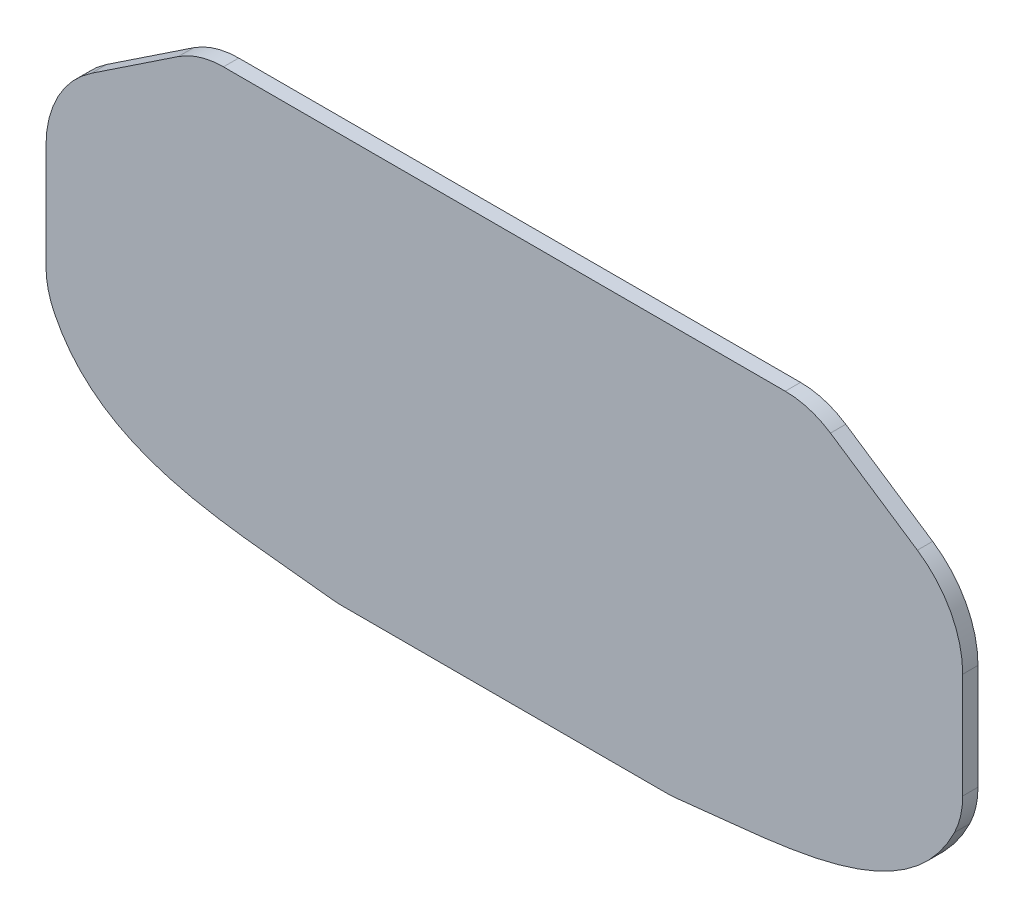
ISO-10303-21;
HEADER;
FILE_DESCRIPTION(('STEP AP214'),'2;1');
FILE_NAME('part.step','',(''),(''),'','','');
FILE_SCHEMA(('AUTOMOTIVE_DESIGN { 1 0 10303 214 1 1 1 1 }'));
ENDSEC;
DATA;
#1=APPLICATION_CONTEXT('core data for automotive mechanical design processes');
#2=APPLICATION_PROTOCOL_DEFINITION('international standard','automotive_design',2000,#1);
#3=PRODUCT_CONTEXT('',#1,'mechanical');
#4=PRODUCT('Part','Part','',(#3));
#5=PRODUCT_RELATED_PRODUCT_CATEGORY('part','',(#4));
#6=PRODUCT_DEFINITION_FORMATION('','',#4);
#7=PRODUCT_DEFINITION_CONTEXT('part definition',#1,'design');
#8=PRODUCT_DEFINITION('design','',#6,#7);
#9=PRODUCT_DEFINITION_SHAPE('','',#8);
#10=(LENGTH_UNIT() NAMED_UNIT(*) SI_UNIT(.MILLI.,.METRE.));
#11=(NAMED_UNIT(*) PLANE_ANGLE_UNIT() SI_UNIT($,.RADIAN.));
#12=(NAMED_UNIT(*) SI_UNIT($,.STERADIAN.) SOLID_ANGLE_UNIT());
#13=UNCERTAINTY_MEASURE_WITH_UNIT(LENGTH_MEASURE(1.E-05),#10,'distance_accuracy_value','');
#14=(GEOMETRIC_REPRESENTATION_CONTEXT(3) GLOBAL_UNCERTAINTY_ASSIGNED_CONTEXT((#13)) GLOBAL_UNIT_ASSIGNED_CONTEXT((#10,
#11,#12)) REPRESENTATION_CONTEXT('',''));
#15=CARTESIAN_POINT('',(0.,0.,0.));
#16=DIRECTION('',(0.,0.,1.));
#17=DIRECTION('',(1.,0.,0.));
#18=AXIS2_PLACEMENT_3D('',#15,#16,#17);
#19=CARTESIAN_POINT('',(0.,0.,3.81));
#20=DIRECTION('',(-1.,0.,0.));
#21=DIRECTION('',(0.,0.,1.));
#22=AXIS2_PLACEMENT_3D('',#19,#20,#21);
#23=PLANE('',#22);
#24=DIRECTION('',(0.,1.,0.));
#25=VECTOR('',#24,1.);
#26=CARTESIAN_POINT('',(0.,0.,0.));
#27=LINE('',#26,#25);
#28=CARTESIAN_POINT('',(0.,36.3067173885473,0.));
#29=VERTEX_POINT('',#28);
#30=CARTESIAN_POINT('',(0.,62.6063325344048,0.));
#31=VERTEX_POINT('',#30);
#32=EDGE_CURVE('E192',#29,#31,#27,.T.);
#33=ORIENTED_EDGE('',*,*,#32,.F.);
#34=DIRECTION('',(0.,0.,1.));
#35=VECTOR('',#34,1.);
#36=CARTESIAN_POINT('',(0.,36.3067173885473,3.81));
#37=LINE('',#36,#35);
#38=CARTESIAN_POINT('',(0.,36.3067173885473,3.81));
#39=VERTEX_POINT('',#38);
#40=EDGE_CURVE('E235',#29,#39,#37,.T.);
#41=ORIENTED_EDGE('',*,*,#40,.T.);
#42=DIRECTION('',(0.,1.,0.));
#43=VECTOR('',#42,1.);
#44=CARTESIAN_POINT('',(0.,0.,3.81));
#45=LINE('',#44,#43);
#46=CARTESIAN_POINT('',(0.,62.6063325344048,3.81));
#47=VERTEX_POINT('',#46);
#48=EDGE_CURVE('E186',#39,#47,#45,.T.);
#49=ORIENTED_EDGE('',*,*,#48,.T.);
#50=DIRECTION('',(0.,0.,-1.));
#51=VECTOR('',#50,1.);
#52=CARTESIAN_POINT('',(0.,62.6063325344048,3.81));
#53=LINE('',#52,#51);
#54=EDGE_CURVE('E217',#47,#31,#53,.T.);
#55=ORIENTED_EDGE('',*,*,#54,.T.);
#56=EDGE_LOOP('',(#33,#41,#49,#55));
#57=FACE_BOUND('',#56,.T.);
#58=ADVANCED_FACE('F43',(#57),#23,.T.);
#59=CARTESIAN_POINT('',(228.6,0.,3.81));
#60=DIRECTION('',(0.,-1.,0.));
#61=DIRECTION('',(0.,0.,-1.));
#62=AXIS2_PLACEMENT_3D('',#59,#60,#61);
#63=PLANE('',#62);
#64=DIRECTION('',(-1.,0.,0.));
#65=VECTOR('',#64,1.);
#66=CARTESIAN_POINT('',(228.6,0.,0.));
#67=LINE('',#66,#65);
#68=CARTESIAN_POINT('',(154.911551716951,0.,0.));
#69=VERTEX_POINT('',#68);
#70=CARTESIAN_POINT('',(73.6884482830485,0.,0.));
#71=VERTEX_POINT('',#70);
#72=EDGE_CURVE('E252',#69,#71,#67,.T.);
#73=ORIENTED_EDGE('',*,*,#72,.F.);
#74=DIRECTION('',(0.,0.,-1.));
#75=VECTOR('',#74,1.);
#76=CARTESIAN_POINT('',(154.911551716951,0.,3.81));
#77=LINE('',#76,#75);
#78=CARTESIAN_POINT('',(154.911551716951,0.,3.81));
#79=VERTEX_POINT('',#78);
#80=EDGE_CURVE('E242',#69,#79,#77,.F.);
#81=ORIENTED_EDGE('',*,*,#80,.T.);
#82=DIRECTION('',(-1.,0.,0.));
#83=VECTOR('',#82,1.);
#84=CARTESIAN_POINT('',(228.6,0.,3.81));
#85=LINE('',#84,#83);
#86=CARTESIAN_POINT('',(73.6884482830485,0.,3.81));
#87=VERTEX_POINT('',#86);
#88=EDGE_CURVE('E189',#79,#87,#85,.T.);
#89=ORIENTED_EDGE('',*,*,#88,.T.);
#90=DIRECTION('',(0.,0.,1.));
#91=VECTOR('',#90,1.);
#92=CARTESIAN_POINT('',(73.6884482830485,0.,3.81));
#93=LINE('',#92,#91);
#94=EDGE_CURVE('E240',#87,#71,#93,.F.);
#95=ORIENTED_EDGE('',*,*,#94,.T.);
#96=EDGE_LOOP('',(#73,#81,#89,#95));
#97=FACE_BOUND('',#96,.T.);
#98=ADVANCED_FACE('F257',(#97),#63,.T.);
#99=CARTESIAN_POINT('',(0.,0.,3.81));
#100=DIRECTION('',(0.,0.,-1.));
#101=DIRECTION('',(-1.,0.,0.));
#102=AXIS2_PLACEMENT_3D('',#99,#100,#101);
#103=PLANE('',#102);
#104=ORIENTED_EDGE('',*,*,#88,.F.);
#105=CARTESIAN_POINT('',(154.911551716951,20.32,3.81));
#106=DIRECTION('',(0.,0.,-1.));
#107=DIRECTION('',(-1.,0.,0.));
#108=AXIS2_PLACEMENT_3D('',#105,#106,#107);
#109=CIRCLE('',#108,20.32);
#110=CARTESIAN_POINT('',(157.543784974881,0.171209761480727,3.81));
#111=VERTEX_POINT('',#110);
#112=EDGE_CURVE('E247',#79,#111,#109,.F.);
#113=ORIENTED_EDGE('',*,*,#112,.T.);
#114=CARTESIAN_POINT('',(228.6,32.4836909668739,3.81));
#115=CARTESIAN_POINT('',(218.54052151117,1.8403987620338,3.81));
#116=CARTESIAN_POINT('',(180.763909957035,3.41703679861688,3.81));
#117=CARTESIAN_POINT('',(156.27521933411,0.,3.81));
#118=B_SPLINE_CURVE_WITH_KNOTS('',3,(#114,#115,#116,#117),.UNSPECIFIED.,.F.,.F.,(4,4),(0.,1.),.UNSPECIFIED.);
#119=CARTESIAN_POINT('',(226.530401820969,27.3722205715367,3.81));
#120=VERTEX_POINT('',#119);
#121=EDGE_CURVE('E266',#120,#111,#118,.T.);
#122=ORIENTED_EDGE('',*,*,#121,.F.);
#123=CARTESIAN_POINT('',(208.28,36.3067173885474,3.81));
#124=DIRECTION('',(0.,0.,-1.));
#125=DIRECTION('',(-1.,0.,0.));
#126=AXIS2_PLACEMENT_3D('',#123,#124,#125);
#127=CIRCLE('',#126,20.32);
#128=CARTESIAN_POINT('',(228.6,36.3067173885474,3.81));
#129=VERTEX_POINT('',#128);
#130=EDGE_CURVE('E227',#120,#129,#127,.F.);
#131=ORIENTED_EDGE('',*,*,#130,.T.);
#132=DIRECTION('',(0.,-1.,0.));
#133=VECTOR('',#132,1.);
#134=CARTESIAN_POINT('',(228.6,76.2,3.81));
#135=LINE('',#134,#133);
#136=CARTESIAN_POINT('',(228.6,62.6063325344049,3.81));
#137=VERTEX_POINT('',#136);
#138=EDGE_CURVE('E362',#137,#129,#135,.T.);
#139=ORIENTED_EDGE('',*,*,#138,.F.);
#140=CARTESIAN_POINT('',(203.2,62.6063325344049,3.81));
#141=DIRECTION('',(0.,0.,-1.));
#142=DIRECTION('',(-1.,0.,0.));
#143=AXIS2_PLACEMENT_3D('',#140,#141,#142);
#144=CIRCLE('',#143,25.4);
#145=CARTESIAN_POINT('',(217.289384984121,83.7404100105861,3.81));
#146=VERTEX_POINT('',#145);
#147=EDGE_CURVE('E215',#137,#146,#144,.F.);
#148=ORIENTED_EDGE('',*,*,#147,.T.);
#149=DIRECTION('',(0.832050294337844,-0.554700196225229,0.));
#150=VECTOR('',#149,1.);
#151=CARTESIAN_POINT('',(190.5,101.6,3.81));
#152=LINE('',#151,#150);
#153=CARTESIAN_POINT('',(195.619107028583,98.1872619809449,3.81));
#154=VERTEX_POINT('',#153);
#155=EDGE_CURVE('E358',#154,#146,#152,.T.);
#156=ORIENTED_EDGE('',*,*,#155,.F.);
#157=CARTESIAN_POINT('',(184.347599041286,81.28,3.81));
#158=DIRECTION('',(0.,0.,-1.));
#159=DIRECTION('',(-1.,0.,0.));
#160=AXIS2_PLACEMENT_3D('',#157,#158,#159);
#161=CIRCLE('',#160,20.32);
#162=CARTESIAN_POINT('',(184.347599041286,101.6,3.81));
#163=VERTEX_POINT('',#162);
#164=EDGE_CURVE('E198',#154,#163,#161,.F.);
#165=ORIENTED_EDGE('',*,*,#164,.T.);
#166=DIRECTION('',(1.,0.,0.));
#167=VECTOR('',#166,1.);
#168=CARTESIAN_POINT('',(38.1,101.6,3.81));
#169=LINE('',#168,#167);
#170=CARTESIAN_POINT('',(44.2524009587141,101.6,3.81));
#171=VERTEX_POINT('',#170);
#172=EDGE_CURVE('E356',#171,#163,#169,.T.);
#173=ORIENTED_EDGE('',*,*,#172,.F.);
#174=CARTESIAN_POINT('',(44.2524009587141,81.28,3.81));
#175=DIRECTION('',(0.,0.,-1.));
#176=DIRECTION('',(-1.,0.,0.));
#177=AXIS2_PLACEMENT_3D('',#174,#175,#176);
#178=CIRCLE('',#177,20.32);
#179=CARTESIAN_POINT('',(32.9808929714175,98.187261980945,3.81));
#180=VERTEX_POINT('',#179);
#181=EDGE_CURVE('E200',#171,#180,#178,.F.);
#182=ORIENTED_EDGE('',*,*,#181,.T.);
#183=DIRECTION('',(0.832050294337843,0.554700196225229,0.));
#184=VECTOR('',#183,1.);
#185=CARTESIAN_POINT('',(0.,76.2,3.81));
#186=LINE('',#185,#184);
#187=CARTESIAN_POINT('',(11.3106150158792,83.7404100105861,3.81));
#188=VERTEX_POINT('',#187);
#189=EDGE_CURVE('E184',#188,#180,#186,.T.);
#190=ORIENTED_EDGE('',*,*,#189,.F.);
#191=CARTESIAN_POINT('',(25.4,62.6063325344048,3.81));
#192=DIRECTION('',(0.,0.,-1.));
#193=DIRECTION('',(-1.,0.,0.));
#194=AXIS2_PLACEMENT_3D('',#191,#192,#193);
#195=CIRCLE('',#194,25.4);
#196=EDGE_CURVE('E212',#188,#47,#195,.F.);
#197=ORIENTED_EDGE('',*,*,#196,.T.);
#198=ORIENTED_EDGE('',*,*,#48,.F.);
#199=CARTESIAN_POINT('',(20.32,36.3067173885473,3.81));
#200=DIRECTION('',(0.,0.,-1.));
#201=DIRECTION('',(-1.,0.,0.));
#202=AXIS2_PLACEMENT_3D('',#199,#200,#201);
#203=CIRCLE('',#202,20.32);
#204=CARTESIAN_POINT('',(2.06959817903115,27.3722205715365,3.81));
#205=VERTEX_POINT('',#204);
#206=EDGE_CURVE('E225',#39,#205,#203,.F.);
#207=ORIENTED_EDGE('',*,*,#206,.T.);
#208=CARTESIAN_POINT('',(0.,32.4836909668739,3.81));
#209=CARTESIAN_POINT('',(10.0594784888304,1.84039876203379,3.81));
#210=CARTESIAN_POINT('',(47.8360900429649,3.41703679861685,3.81));
#211=CARTESIAN_POINT('',(72.3247806658904,0.,3.81));
#212=B_SPLINE_CURVE_WITH_KNOTS('',3,(#208,#209,#210,#211),.UNSPECIFIED.,.F.,.F.,(4,4),(0.,1.),.UNSPECIFIED.);
#213=CARTESIAN_POINT('',(71.0562150251189,0.171209761480717,3.81));
#214=VERTEX_POINT('',#213);
#215=EDGE_CURVE('E269',#205,#214,#212,.T.);
#216=ORIENTED_EDGE('',*,*,#215,.T.);
#217=CARTESIAN_POINT('',(73.6884482830485,20.32,3.81));
#218=DIRECTION('',(0.,0.,-1.));
#219=DIRECTION('',(-1.,0.,0.));
#220=AXIS2_PLACEMENT_3D('',#217,#218,#219);
#221=CIRCLE('',#220,20.32);
#222=EDGE_CURVE('E245',#214,#87,#221,.F.);
#223=ORIENTED_EDGE('',*,*,#222,.T.);
#224=EDGE_LOOP('',(#104,#113,#122,#131,#139,#148,#156,#165,#173,#182,#190,#197,#198,#207,#216,#223));
#225=FACE_BOUND('',#224,.T.);
#226=ADVANCED_FACE('F265',(#225),#103,.F.);
#227=CARTESIAN_POINT('',(0.,0.,0.));
#228=DIRECTION('',(0.,0.,-1.));
#229=DIRECTION('',(-1.,0.,0.));
#230=AXIS2_PLACEMENT_3D('',#227,#228,#229);
#231=PLANE('',#230);
#232=CARTESIAN_POINT('',(228.6,32.4836909668739,0.));
#233=CARTESIAN_POINT('',(218.54052151117,1.8403987620338,0.));
#234=CARTESIAN_POINT('',(180.763909957035,3.41703679861688,0.));
#235=CARTESIAN_POINT('',(156.27521933411,0.,0.));
#236=B_SPLINE_CURVE_WITH_KNOTS('',3,(#232,#233,#234,#235),.UNSPECIFIED.,.F.,.F.,(4,4),(0.,1.),.UNSPECIFIED.);
#237=CARTESIAN_POINT('',(226.530401820969,27.3722205715367,0.));
#238=VERTEX_POINT('',#237);
#239=CARTESIAN_POINT('',(157.543784974881,0.171209761480727,0.));
#240=VERTEX_POINT('',#239);
#241=EDGE_CURVE('E253',#238,#240,#236,.T.);
#242=ORIENTED_EDGE('',*,*,#241,.T.);
#243=CARTESIAN_POINT('',(154.911551716951,20.32,0.));
#244=DIRECTION('',(0.,0.,-1.));
#245=DIRECTION('',(-1.,0.,0.));
#246=AXIS2_PLACEMENT_3D('',#243,#244,#245);
#247=CIRCLE('',#246,20.32);
#248=EDGE_CURVE('E51',#240,#69,#247,.T.);
#249=ORIENTED_EDGE('',*,*,#248,.T.);
#250=ORIENTED_EDGE('',*,*,#72,.T.);
#251=CARTESIAN_POINT('',(73.6884482830485,20.32,0.));
#252=DIRECTION('',(0.,0.,-1.));
#253=DIRECTION('',(-1.,0.,0.));
#254=AXIS2_PLACEMENT_3D('',#251,#252,#253);
#255=CIRCLE('',#254,20.32);
#256=CARTESIAN_POINT('',(71.0562150251189,0.171209761480717,0.));
#257=VERTEX_POINT('',#256);
#258=EDGE_CURVE('E58',#71,#257,#255,.T.);
#259=ORIENTED_EDGE('',*,*,#258,.T.);
#260=CARTESIAN_POINT('',(0.,32.4836909668739,0.));
#261=CARTESIAN_POINT('',(10.0594784888304,1.84039876203379,0.));
#262=CARTESIAN_POINT('',(47.8360900429649,3.41703679861685,0.));
#263=CARTESIAN_POINT('',(72.3247806658904,0.,0.));
#264=B_SPLINE_CURVE_WITH_KNOTS('',3,(#260,#261,#262,#263),.UNSPECIFIED.,.F.,.F.,(4,4),(0.,1.),.UNSPECIFIED.);
#265=CARTESIAN_POINT('',(2.06959817903116,27.3722205715364,0.));
#266=VERTEX_POINT('',#265);
#267=EDGE_CURVE('E170',#266,#257,#264,.T.);
#268=ORIENTED_EDGE('',*,*,#267,.F.);
#269=CARTESIAN_POINT('',(20.32,36.3067173885473,0.));
#270=DIRECTION('',(0.,0.,-1.));
#271=DIRECTION('',(-1.,0.,0.));
#272=AXIS2_PLACEMENT_3D('',#269,#270,#271);
#273=CIRCLE('',#272,20.32);
#274=EDGE_CURVE('E231',#266,#29,#273,.T.);
#275=ORIENTED_EDGE('',*,*,#274,.T.);
#276=ORIENTED_EDGE('',*,*,#32,.T.);
#277=CARTESIAN_POINT('',(25.4,62.6063325344048,0.));
#278=DIRECTION('',(0.,0.,-1.));
#279=DIRECTION('',(-1.,0.,0.));
#280=AXIS2_PLACEMENT_3D('',#277,#278,#279);
#281=CIRCLE('',#280,25.4);
#282=CARTESIAN_POINT('',(11.3106150158792,83.7404100105861,0.));
#283=VERTEX_POINT('',#282);
#284=EDGE_CURVE('E165',#31,#283,#281,.T.);
#285=ORIENTED_EDGE('',*,*,#284,.T.);
#286=DIRECTION('',(0.832050294337843,0.554700196225229,0.));
#287=VECTOR('',#286,1.);
#288=CARTESIAN_POINT('',(0.,76.2,0.));
#289=LINE('',#288,#287);
#290=CARTESIAN_POINT('',(32.9808929714175,98.187261980945,0.));
#291=VERTEX_POINT('',#290);
#292=EDGE_CURVE('E158',#283,#291,#289,.T.);
#293=ORIENTED_EDGE('',*,*,#292,.T.);
#294=CARTESIAN_POINT('',(44.2524009587141,81.28,0.));
#295=DIRECTION('',(0.,0.,-1.));
#296=DIRECTION('',(-1.,0.,0.));
#297=AXIS2_PLACEMENT_3D('',#294,#295,#296);
#298=CIRCLE('',#297,20.32);
#299=CARTESIAN_POINT('',(44.2524009587141,101.6,0.));
#300=VERTEX_POINT('',#299);
#301=EDGE_CURVE('E162',#291,#300,#298,.T.);
#302=ORIENTED_EDGE('',*,*,#301,.T.);
#303=DIRECTION('',(1.,0.,0.));
#304=VECTOR('',#303,1.);
#305=CARTESIAN_POINT('',(38.1,101.6,0.));
#306=LINE('',#305,#304);
#307=CARTESIAN_POINT('',(184.347599041286,101.6,0.));
#308=VERTEX_POINT('',#307);
#309=EDGE_CURVE('E169',#300,#308,#306,.T.);
#310=ORIENTED_EDGE('',*,*,#309,.T.);
#311=CARTESIAN_POINT('',(184.347599041286,81.28,0.));
#312=DIRECTION('',(0.,0.,-1.));
#313=DIRECTION('',(-1.,0.,0.));
#314=AXIS2_PLACEMENT_3D('',#311,#312,#313);
#315=CIRCLE('',#314,20.32);
#316=CARTESIAN_POINT('',(195.619107028583,98.1872619809449,0.));
#317=VERTEX_POINT('',#316);
#318=EDGE_CURVE('E180',#308,#317,#315,.T.);
#319=ORIENTED_EDGE('',*,*,#318,.T.);
#320=DIRECTION('',(0.832050294337844,-0.554700196225229,0.));
#321=VECTOR('',#320,1.);
#322=CARTESIAN_POINT('',(190.5,101.6,0.));
#323=LINE('',#322,#321);
#324=CARTESIAN_POINT('',(217.289384984121,83.7404100105861,0.));
#325=VERTEX_POINT('',#324);
#326=EDGE_CURVE('E369',#317,#325,#323,.T.);
#327=ORIENTED_EDGE('',*,*,#326,.T.);
#328=CARTESIAN_POINT('',(203.2,62.6063325344049,0.));
#329=DIRECTION('',(0.,0.,-1.));
#330=DIRECTION('',(-1.,0.,0.));
#331=AXIS2_PLACEMENT_3D('',#328,#329,#330);
#332=CIRCLE('',#331,25.4);
#333=CARTESIAN_POINT('',(228.6,62.6063325344049,0.));
#334=VERTEX_POINT('',#333);
#335=EDGE_CURVE('E208',#325,#334,#332,.T.);
#336=ORIENTED_EDGE('',*,*,#335,.T.);
#337=DIRECTION('',(0.,-1.,0.));
#338=VECTOR('',#337,1.);
#339=CARTESIAN_POINT('',(228.6,76.2,0.));
#340=LINE('',#339,#338);
#341=CARTESIAN_POINT('',(228.6,36.3067173885474,0.));
#342=VERTEX_POINT('',#341);
#343=EDGE_CURVE('E261',#334,#342,#340,.T.);
#344=ORIENTED_EDGE('',*,*,#343,.T.);
#345=CARTESIAN_POINT('',(208.28,36.3067173885474,0.));
#346=DIRECTION('',(0.,0.,-1.));
#347=DIRECTION('',(-1.,0.,0.));
#348=AXIS2_PLACEMENT_3D('',#345,#346,#347);
#349=CIRCLE('',#348,20.32);
#350=EDGE_CURVE('E233',#342,#238,#349,.T.);
#351=ORIENTED_EDGE('',*,*,#350,.T.);
#352=EDGE_LOOP('',(#242,#249,#250,#259,#268,#275,#276,#285,#293,#302,#310,#319,#327,#336,#344,#351));
#353=FACE_BOUND('',#352,.T.);
#354=ADVANCED_FACE('F160',(#353),#231,.T.);
#355=CARTESIAN_POINT('',(0.,76.2,3.81));
#356=DIRECTION('',(-0.554700196225229,0.832050294337844,0.));
#357=DIRECTION('',(-0.832050294337844,-0.554700196225229,0.));
#358=AXIS2_PLACEMENT_3D('',#355,#356,#357);
#359=PLANE('',#358);
#360=ORIENTED_EDGE('',*,*,#292,.F.);
#361=DIRECTION('',(0.,0.,-1.));
#362=VECTOR('',#361,1.);
#363=CARTESIAN_POINT('',(11.3106150158792,83.7404100105861,3.81));
#364=LINE('',#363,#362);
#365=EDGE_CURVE('E220',#283,#188,#364,.F.);
#366=ORIENTED_EDGE('',*,*,#365,.T.);
#367=ORIENTED_EDGE('',*,*,#189,.T.);
#368=DIRECTION('',(0.,0.,-1.));
#369=VECTOR('',#368,1.);
#370=CARTESIAN_POINT('',(32.9808929714175,98.187261980945,3.81));
#371=LINE('',#370,#369);
#372=EDGE_CURVE('E177',#180,#291,#371,.T.);
#373=ORIENTED_EDGE('',*,*,#372,.T.);
#374=EDGE_LOOP('',(#360,#366,#367,#373));
#375=FACE_BOUND('',#374,.T.);
#376=ADVANCED_FACE('F182',(#375),#359,.T.);
#377=CARTESIAN_POINT('',(228.6,76.2,3.81));
#378=DIRECTION('',(1.,0.,0.));
#379=DIRECTION('',(0.,0.,-1.));
#380=AXIS2_PLACEMENT_3D('',#377,#378,#379);
#381=PLANE('',#380);
#382=ORIENTED_EDGE('',*,*,#138,.T.);
#383=DIRECTION('',(0.,0.,-1.));
#384=VECTOR('',#383,1.);
#385=CARTESIAN_POINT('',(228.6,36.3067173885474,0.));
#386=LINE('',#385,#384);
#387=EDGE_CURVE('E229',#129,#342,#386,.T.);
#388=ORIENTED_EDGE('',*,*,#387,.T.);
#389=ORIENTED_EDGE('',*,*,#343,.F.);
#390=DIRECTION('',(0.,0.,-1.));
#391=VECTOR('',#390,1.);
#392=CARTESIAN_POINT('',(228.6,62.6063325344049,3.81));
#393=LINE('',#392,#391);
#394=EDGE_CURVE('E210',#334,#137,#393,.F.);
#395=ORIENTED_EDGE('',*,*,#394,.T.);
#396=EDGE_LOOP('',(#382,#388,#389,#395));
#397=FACE_BOUND('',#396,.T.);
#398=ADVANCED_FACE('F305',(#397),#381,.T.);
#399=CARTESIAN_POINT('',(190.5,101.6,3.81));
#400=DIRECTION('',(0.554700196225229,0.832050294337843,0.));
#401=DIRECTION('',(-0.832050294337844,0.554700196225229,0.));
#402=AXIS2_PLACEMENT_3D('',#399,#400,#401);
#403=PLANE('',#402);
#404=ORIENTED_EDGE('',*,*,#155,.T.);
#405=DIRECTION('',(0.,0.,-1.));
#406=VECTOR('',#405,1.);
#407=CARTESIAN_POINT('',(217.289384984121,83.7404100105861,3.81));
#408=LINE('',#407,#406);
#409=EDGE_CURVE('E204',#146,#325,#408,.T.);
#410=ORIENTED_EDGE('',*,*,#409,.T.);
#411=ORIENTED_EDGE('',*,*,#326,.F.);
#412=DIRECTION('',(0.,0.,-1.));
#413=VECTOR('',#412,1.);
#414=CARTESIAN_POINT('',(195.619107028583,98.1872619809449,3.81));
#415=LINE('',#414,#413);
#416=EDGE_CURVE('E202',#317,#154,#415,.F.);
#417=ORIENTED_EDGE('',*,*,#416,.T.);
#418=EDGE_LOOP('',(#404,#410,#411,#417));
#419=FACE_BOUND('',#418,.T.);
#420=ADVANCED_FACE('F308',(#419),#403,.T.);
#421=CARTESIAN_POINT('',(38.1,101.6,3.81));
#422=DIRECTION('',(0.,1.,0.));
#423=DIRECTION('',(0.,0.,1.));
#424=AXIS2_PLACEMENT_3D('',#421,#422,#423);
#425=PLANE('',#424);
#426=ORIENTED_EDGE('',*,*,#309,.F.);
#427=DIRECTION('',(0.,0.,-1.));
#428=VECTOR('',#427,1.);
#429=CARTESIAN_POINT('',(44.2524009587141,101.6,3.81));
#430=LINE('',#429,#428);
#431=EDGE_CURVE('E178',#300,#171,#430,.F.);
#432=ORIENTED_EDGE('',*,*,#431,.T.);
#433=ORIENTED_EDGE('',*,*,#172,.T.);
#434=DIRECTION('',(0.,0.,-1.));
#435=VECTOR('',#434,1.);
#436=CARTESIAN_POINT('',(184.347599041286,101.6,3.81));
#437=LINE('',#436,#435);
#438=EDGE_CURVE('E179',#163,#308,#437,.T.);
#439=ORIENTED_EDGE('',*,*,#438,.T.);
#440=EDGE_LOOP('',(#426,#432,#433,#439));
#441=FACE_BOUND('',#440,.T.);
#442=ADVANCED_FACE('F312',(#441),#425,.T.);
#443=CARTESIAN_POINT('',(44.2524009587141,81.28,3.81));
#444=DIRECTION('',(0.,0.,-1.));
#445=DIRECTION('',(-1.,0.,0.));
#446=AXIS2_PLACEMENT_3D('',#443,#444,#445);
#447=CYLINDRICAL_SURFACE('',#446,20.32);
#448=ORIENTED_EDGE('',*,*,#181,.F.);
#449=ORIENTED_EDGE('',*,*,#431,.F.);
#450=ORIENTED_EDGE('',*,*,#301,.F.);
#451=ORIENTED_EDGE('',*,*,#372,.F.);
#452=EDGE_LOOP('',(#448,#449,#450,#451));
#453=FACE_BOUND('',#452,.T.);
#454=ADVANCED_FACE('F176',(#453),#447,.T.);
#455=CARTESIAN_POINT('',(184.347599041286,81.28,3.81));
#456=DIRECTION('',(0.,0.,-1.));
#457=DIRECTION('',(-1.,0.,0.));
#458=AXIS2_PLACEMENT_3D('',#455,#456,#457);
#459=CYLINDRICAL_SURFACE('',#458,20.32);
#460=ORIENTED_EDGE('',*,*,#164,.F.);
#461=ORIENTED_EDGE('',*,*,#416,.F.);
#462=ORIENTED_EDGE('',*,*,#318,.F.);
#463=ORIENTED_EDGE('',*,*,#438,.F.);
#464=EDGE_LOOP('',(#460,#461,#462,#463));
#465=FACE_BOUND('',#464,.T.);
#466=ADVANCED_FACE('F321',(#465),#459,.T.);
#467=CARTESIAN_POINT('',(203.2,62.6063325344049,3.81));
#468=DIRECTION('',(0.,0.,-1.));
#469=DIRECTION('',(-1.,0.,0.));
#470=AXIS2_PLACEMENT_3D('',#467,#468,#469);
#471=CYLINDRICAL_SURFACE('',#470,25.4);
#472=ORIENTED_EDGE('',*,*,#147,.F.);
#473=ORIENTED_EDGE('',*,*,#394,.F.);
#474=ORIENTED_EDGE('',*,*,#335,.F.);
#475=ORIENTED_EDGE('',*,*,#409,.F.);
#476=EDGE_LOOP('',(#472,#473,#474,#475));
#477=FACE_BOUND('',#476,.T.);
#478=ADVANCED_FACE('F324',(#477),#471,.T.);
#479=CARTESIAN_POINT('',(25.4,62.6063325344048,3.81));
#480=DIRECTION('',(0.,0.,-1.));
#481=DIRECTION('',(-1.,0.,0.));
#482=AXIS2_PLACEMENT_3D('',#479,#480,#481);
#483=CYLINDRICAL_SURFACE('',#482,25.4);
#484=ORIENTED_EDGE('',*,*,#196,.F.);
#485=ORIENTED_EDGE('',*,*,#365,.F.);
#486=ORIENTED_EDGE('',*,*,#284,.F.);
#487=ORIENTED_EDGE('',*,*,#54,.F.);
#488=EDGE_LOOP('',(#484,#485,#486,#487));
#489=FACE_BOUND('',#488,.T.);
#490=ADVANCED_FACE('F295',(#489),#483,.T.);
#491=DIRECTION('',(0.,0.,1.));
#492=VECTOR('',#491,1.);
#493=SURFACE_OF_LINEAR_EXTRUSION('',#236,#492);
#494=ORIENTED_EDGE('',*,*,#121,.T.);
#495=DIRECTION('',(0.,0.,1.));
#496=VECTOR('',#495,1.);
#497=CARTESIAN_POINT('',(157.543784974872,0.171209761479561,3.81));
#498=LINE('',#497,#496);
#499=EDGE_CURVE('E66',#111,#240,#498,.F.);
#500=ORIENTED_EDGE('',*,*,#499,.T.);
#501=ORIENTED_EDGE('',*,*,#241,.F.);
#502=DIRECTION('',(0.,0.,1.));
#503=VECTOR('',#502,1.);
#504=CARTESIAN_POINT('',(226.530401820969,27.3722205715366,0.));
#505=LINE('',#504,#503);
#506=EDGE_CURVE('E222',#238,#120,#505,.T.);
#507=ORIENTED_EDGE('',*,*,#506,.T.);
#508=EDGE_LOOP('',(#494,#500,#501,#507));
#509=FACE_BOUND('',#508,.T.);
#510=ADVANCED_FACE('F267',(#509),#493,.F.);
#511=DIRECTION('',(0.,0.,1.));
#512=VECTOR('',#511,1.);
#513=SURFACE_OF_LINEAR_EXTRUSION('',#264,#512);
#514=ORIENTED_EDGE('',*,*,#267,.T.);
#515=DIRECTION('',(0.,0.,1.));
#516=VECTOR('',#515,1.);
#517=CARTESIAN_POINT('',(71.0562150251279,0.171209761479553,0.));
#518=LINE('',#517,#516);
#519=EDGE_CURVE('E11',#257,#214,#518,.T.);
#520=ORIENTED_EDGE('',*,*,#519,.T.);
#521=ORIENTED_EDGE('',*,*,#215,.F.);
#522=DIRECTION('',(0.,0.,1.));
#523=VECTOR('',#522,1.);
#524=CARTESIAN_POINT('',(2.06959817903116,27.3722205715365,3.81));
#525=LINE('',#524,#523);
#526=EDGE_CURVE('E238',#205,#266,#525,.F.);
#527=ORIENTED_EDGE('',*,*,#526,.T.);
#528=EDGE_LOOP('',(#514,#520,#521,#527));
#529=FACE_BOUND('',#528,.T.);
#530=ADVANCED_FACE('F294',(#529),#513,.T.);
#531=CARTESIAN_POINT('',(208.28,36.3067173885474,1.905));
#532=DIRECTION('',(0.,0.,1.));
#533=DIRECTION('',(1.,0.,0.));
#534=AXIS2_PLACEMENT_3D('',#531,#532,#533);
#535=CYLINDRICAL_SURFACE('',#534,20.32);
#536=ORIENTED_EDGE('',*,*,#350,.F.);
#537=ORIENTED_EDGE('',*,*,#387,.F.);
#538=ORIENTED_EDGE('',*,*,#130,.F.);
#539=ORIENTED_EDGE('',*,*,#506,.F.);
#540=EDGE_LOOP('',(#536,#537,#538,#539));
#541=FACE_BOUND('',#540,.T.);
#542=ADVANCED_FACE('F332',(#541),#535,.T.);
#543=CARTESIAN_POINT('',(20.32,36.3067173885473,1.905));
#544=DIRECTION('',(0.,0.,1.));
#545=DIRECTION('',(1.,0.,0.));
#546=AXIS2_PLACEMENT_3D('',#543,#544,#545);
#547=CYLINDRICAL_SURFACE('',#546,20.32);
#548=ORIENTED_EDGE('',*,*,#274,.F.);
#549=ORIENTED_EDGE('',*,*,#526,.F.);
#550=ORIENTED_EDGE('',*,*,#206,.F.);
#551=ORIENTED_EDGE('',*,*,#40,.F.);
#552=EDGE_LOOP('',(#548,#549,#550,#551));
#553=FACE_BOUND('',#552,.T.);
#554=ADVANCED_FACE('F335',(#553),#547,.T.);
#555=CARTESIAN_POINT('',(154.911551716951,20.32,1.905));
#556=DIRECTION('',(0.,0.,1.));
#557=DIRECTION('',(1.,0.,0.));
#558=AXIS2_PLACEMENT_3D('',#555,#556,#557);
#559=CYLINDRICAL_SURFACE('',#558,20.32);
#560=ORIENTED_EDGE('',*,*,#248,.F.);
#561=ORIENTED_EDGE('',*,*,#499,.F.);
#562=ORIENTED_EDGE('',*,*,#112,.F.);
#563=ORIENTED_EDGE('',*,*,#80,.F.);
#564=EDGE_LOOP('',(#560,#561,#562,#563));
#565=FACE_BOUND('',#564,.T.);
#566=ADVANCED_FACE('F262',(#565),#559,.T.);
#567=CARTESIAN_POINT('',(73.6884482830485,20.32,1.905));
#568=DIRECTION('',(0.,0.,1.));
#569=DIRECTION('',(1.,0.,0.));
#570=AXIS2_PLACEMENT_3D('',#567,#568,#569);
#571=CYLINDRICAL_SURFACE('',#570,20.32);
#572=ORIENTED_EDGE('',*,*,#258,.F.);
#573=ORIENTED_EDGE('',*,*,#94,.F.);
#574=ORIENTED_EDGE('',*,*,#222,.F.);
#575=ORIENTED_EDGE('',*,*,#519,.F.);
#576=EDGE_LOOP('',(#572,#573,#574,#575));
#577=FACE_BOUND('',#576,.T.);
#578=ADVANCED_FACE('F45',(#577),#571,.T.);
#579=CLOSED_SHELL('',(#58,#98,#226,#354,#376,#398,#420,#442,#454,#466,#478,#490,#510,#530,#542,
#554,#566,#578));
#580=MANIFOLD_SOLID_BREP('B2',#579);
#581=ADVANCED_BREP_SHAPE_REPRESENTATION('',(#18,#580),#14);
#582=SHAPE_DEFINITION_REPRESENTATION(#9,#581);
ENDSEC;
END-ISO-10303-21;
